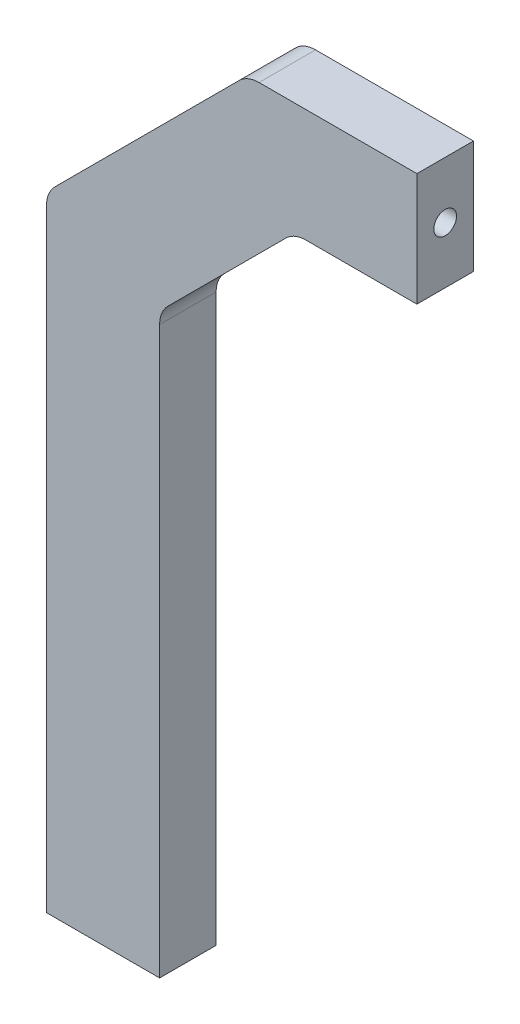
ISO-10303-21;
HEADER;
FILE_DESCRIPTION(('STEP AP214'),'2;1');
FILE_NAME('part.step','',(''),(''),'','','');
FILE_SCHEMA(('AUTOMOTIVE_DESIGN { 1 0 10303 214 1 1 1 1 }'));
ENDSEC;
DATA;
#1=APPLICATION_CONTEXT('core data for automotive mechanical design processes');
#2=APPLICATION_PROTOCOL_DEFINITION('international standard','automotive_design',2000,#1);
#3=PRODUCT_CONTEXT('',#1,'mechanical');
#4=PRODUCT('Part','Part','',(#3));
#5=PRODUCT_RELATED_PRODUCT_CATEGORY('part','',(#4));
#6=PRODUCT_DEFINITION_FORMATION('','',#4);
#7=PRODUCT_DEFINITION_CONTEXT('part definition',#1,'design');
#8=PRODUCT_DEFINITION('design','',#6,#7);
#9=PRODUCT_DEFINITION_SHAPE('','',#8);
#10=(LENGTH_UNIT() NAMED_UNIT(*) SI_UNIT(.MILLI.,.METRE.));
#11=(NAMED_UNIT(*) PLANE_ANGLE_UNIT() SI_UNIT($,.RADIAN.));
#12=(NAMED_UNIT(*) SI_UNIT($,.STERADIAN.) SOLID_ANGLE_UNIT());
#13=UNCERTAINTY_MEASURE_WITH_UNIT(LENGTH_MEASURE(1.E-05),#10,'distance_accuracy_value','');
#14=(GEOMETRIC_REPRESENTATION_CONTEXT(3) GLOBAL_UNCERTAINTY_ASSIGNED_CONTEXT((#13)) GLOBAL_UNIT_ASSIGNED_CONTEXT((#10,
#11,#12)) REPRESENTATION_CONTEXT('',''));
#15=CARTESIAN_POINT('',(0.,0.,0.));
#16=DIRECTION('',(0.,0.,1.));
#17=DIRECTION('',(1.,0.,0.));
#18=AXIS2_PLACEMENT_3D('',#15,#16,#17);
#19=CARTESIAN_POINT('',(0.,12.7,6.35));
#20=DIRECTION('',(0.,-1.,0.));
#21=DIRECTION('',(1.,0.,0.));
#22=AXIS2_PLACEMENT_3D('',#19,#20,#21);
#23=PLANE('',#22);
#24=DIRECTION('',(-1.,0.,0.));
#25=VECTOR('',#24,1.);
#26=CARTESIAN_POINT('',(0.,12.7,-6.35));
#27=LINE('',#26,#25);
#28=CARTESIAN_POINT('',(0.,12.7,-6.35));
#29=VERTEX_POINT('',#28);
#30=CARTESIAN_POINT('',(-35.4697438789308,12.7,-6.35));
#31=VERTEX_POINT('',#30);
#32=EDGE_CURVE('E157',#29,#31,#27,.T.);
#33=ORIENTED_EDGE('',*,*,#32,.T.);
#34=DIRECTION('',(0.,0.,-1.));
#35=VECTOR('',#34,1.);
#36=CARTESIAN_POINT('',(-35.4697438789308,12.7,6.35));
#37=LINE('',#36,#35);
#38=CARTESIAN_POINT('',(-35.4697438789308,12.7,6.35));
#39=VERTEX_POINT('',#38);
#40=EDGE_CURVE('E64',#31,#39,#37,.F.);
#41=ORIENTED_EDGE('',*,*,#40,.T.);
#42=DIRECTION('',(-1.,0.,0.));
#43=VECTOR('',#42,1.);
#44=CARTESIAN_POINT('',(0.,12.7,6.35));
#45=LINE('',#44,#43);
#46=CARTESIAN_POINT('',(0.,12.7,6.35));
#47=VERTEX_POINT('',#46);
#48=EDGE_CURVE('E158',#47,#39,#45,.T.);
#49=ORIENTED_EDGE('',*,*,#48,.F.);
#50=DIRECTION('',(0.,0.,-1.));
#51=VECTOR('',#50,1.);
#52=CARTESIAN_POINT('',(0.,12.7,6.35));
#53=LINE('',#52,#51);
#54=EDGE_CURVE('E177',#47,#29,#53,.T.);
#55=ORIENTED_EDGE('',*,*,#54,.T.);
#56=EDGE_LOOP('',(#33,#41,#49,#55));
#57=FACE_BOUND('',#56,.T.);
#58=ADVANCED_FACE('F41',(#57),#23,.F.);
#59=CARTESIAN_POINT('',(-38.1,12.7,6.35));
#60=DIRECTION('',(0.707106781186549,-0.707106781186546,0.));
#61=DIRECTION('',(0.707106781186546,0.707106781186549,0.));
#62=AXIS2_PLACEMENT_3D('',#59,#60,#61);
#63=PLANE('',#62);
#64=DIRECTION('',(-0.707106781186546,-0.707106781186549,0.));
#65=VECTOR('',#64,1.);
#66=CARTESIAN_POINT('',(-38.1,12.7,6.35));
#67=LINE('',#66,#65);
#68=CARTESIAN_POINT('',(-39.9598719394654,10.8401280605346,6.35));
#69=VERTEX_POINT('',#68);
#70=CARTESIAN_POINT('',(-81.3505280605346,-30.5505280605347,6.35));
#71=VERTEX_POINT('',#70);
#72=EDGE_CURVE('E160',#69,#71,#67,.T.);
#73=ORIENTED_EDGE('',*,*,#72,.F.);
#74=DIRECTION('',(0.,0.,-1.));
#75=VECTOR('',#74,1.);
#76=CARTESIAN_POINT('',(-39.9598719394654,10.8401280605346,6.35));
#77=LINE('',#76,#75);
#78=CARTESIAN_POINT('',(-39.9598719394654,10.8401280605346,-6.35));
#79=VERTEX_POINT('',#78);
#80=EDGE_CURVE('E218',#69,#79,#77,.T.);
#81=ORIENTED_EDGE('',*,*,#80,.T.);
#82=DIRECTION('',(-0.707106781186546,-0.707106781186549,0.));
#83=VECTOR('',#82,1.);
#84=CARTESIAN_POINT('',(-38.1,12.7,-6.35));
#85=LINE('',#84,#83);
#86=CARTESIAN_POINT('',(-81.3505280605346,-30.5505280605347,-6.35));
#87=VERTEX_POINT('',#86);
#88=EDGE_CURVE('E179',#79,#87,#85,.T.);
#89=ORIENTED_EDGE('',*,*,#88,.T.);
#90=DIRECTION('',(0.,0.,-1.));
#91=VECTOR('',#90,1.);
#92=CARTESIAN_POINT('',(-81.3505280605346,-30.5505280605347,6.35));
#93=LINE('',#92,#91);
#94=EDGE_CURVE('E216',#87,#71,#93,.F.);
#95=ORIENTED_EDGE('',*,*,#94,.T.);
#96=EDGE_LOOP('',(#73,#81,#89,#95));
#97=FACE_BOUND('',#96,.T.);
#98=ADVANCED_FACE('F275',(#97),#63,.F.);
#99=CARTESIAN_POINT('',(-83.2104,-32.4104000000002,6.35));
#100=DIRECTION('',(1.,0.,0.));
#101=DIRECTION('',(0.,0.,-1.));
#102=AXIS2_PLACEMENT_3D('',#99,#100,#101);
#103=PLANE('',#102);
#104=DIRECTION('',(0.,-1.,0.));
#105=VECTOR('',#104,1.);
#106=CARTESIAN_POINT('',(-83.2104,-32.4104000000002,6.35));
#107=LINE('',#106,#105);
#108=CARTESIAN_POINT('',(-83.2104,-35.0406561210693,6.35));
#109=VERTEX_POINT('',#108);
#110=CARTESIAN_POINT('',(-83.2104,-172.72,6.35));
#111=VERTEX_POINT('',#110);
#112=EDGE_CURVE('E163',#109,#111,#107,.T.);
#113=ORIENTED_EDGE('',*,*,#112,.F.);
#114=DIRECTION('',(0.,0.,-1.));
#115=VECTOR('',#114,1.);
#116=CARTESIAN_POINT('',(-83.2104,-35.0406561210693,6.35));
#117=LINE('',#116,#115);
#118=CARTESIAN_POINT('',(-83.2104,-35.0406561210693,-6.35));
#119=VERTEX_POINT('',#118);
#120=EDGE_CURVE('E229',#109,#119,#117,.T.);
#121=ORIENTED_EDGE('',*,*,#120,.T.);
#122=DIRECTION('',(0.,-1.,0.));
#123=VECTOR('',#122,1.);
#124=CARTESIAN_POINT('',(-83.2104,-32.4104000000002,-6.35));
#125=LINE('',#124,#123);
#126=CARTESIAN_POINT('',(-83.2104,-172.72,-6.35));
#127=VERTEX_POINT('',#126);
#128=EDGE_CURVE('E182',#119,#127,#125,.T.);
#129=ORIENTED_EDGE('',*,*,#128,.T.);
#130=DIRECTION('',(0.,0.,-1.));
#131=VECTOR('',#130,1.);
#132=CARTESIAN_POINT('',(-83.2104,-172.72,6.35));
#133=LINE('',#132,#131);
#134=EDGE_CURVE('E203',#111,#127,#133,.T.);
#135=ORIENTED_EDGE('',*,*,#134,.F.);
#136=EDGE_LOOP('',(#113,#121,#129,#135));
#137=FACE_BOUND('',#136,.T.);
#138=ADVANCED_FACE('F282',(#137),#103,.F.);
#139=CARTESIAN_POINT('',(-57.8104,-172.72,6.35));
#140=DIRECTION('',(0.,1.,0.));
#141=DIRECTION('',(0.,0.,1.));
#142=AXIS2_PLACEMENT_3D('',#139,#140,#141);
#143=PLANE('',#142);
#144=CARTESIAN_POINT('',(-70.5104,-172.72,0.));
#145=DIRECTION('',(0.,-1.,0.));
#146=DIRECTION('',(0.,0.,-1.));
#147=AXIS2_PLACEMENT_3D('',#144,#145,#146);
#148=CIRCLE('',#147,2.55269999999999);
#149=CARTESIAN_POINT('',(-70.5104,-172.72,-2.55269999999999));
#150=VERTEX_POINT('',#149);
#151=EDGE_CURVE('E147',#150,#150,#148,.T.);
#152=ORIENTED_EDGE('',*,*,#151,.F.);
#153=EDGE_LOOP('',(#152));
#154=FACE_BOUND('',#153,.T.);
#155=DIRECTION('',(1.,0.,0.));
#156=VECTOR('',#155,1.);
#157=CARTESIAN_POINT('',(-57.8104,-172.72,-6.35));
#158=LINE('',#157,#156);
#159=CARTESIAN_POINT('',(-57.8104,-172.72,-6.35));
#160=VERTEX_POINT('',#159);
#161=EDGE_CURVE('E184',#127,#160,#158,.T.);
#162=ORIENTED_EDGE('',*,*,#161,.T.);
#163=DIRECTION('',(0.,0.,-1.));
#164=VECTOR('',#163,1.);
#165=CARTESIAN_POINT('',(-57.8104,-172.72,6.35));
#166=LINE('',#165,#164);
#167=CARTESIAN_POINT('',(-57.8104,-172.72,6.35));
#168=VERTEX_POINT('',#167);
#169=EDGE_CURVE('E200',#168,#160,#166,.T.);
#170=ORIENTED_EDGE('',*,*,#169,.F.);
#171=DIRECTION('',(1.,0.,0.));
#172=VECTOR('',#171,1.);
#173=CARTESIAN_POINT('',(-57.8104,-172.72,6.35));
#174=LINE('',#173,#172);
#175=EDGE_CURVE('E165',#111,#168,#174,.T.);
#176=ORIENTED_EDGE('',*,*,#175,.F.);
#177=ORIENTED_EDGE('',*,*,#134,.T.);
#178=EDGE_LOOP('',(#162,#170,#176,#177));
#179=FACE_BOUND('',#178,.T.);
#180=ADVANCED_FACE('F286',(#154,#179),#143,.F.);
#181=CARTESIAN_POINT('',(-57.8104,-42.9314244842767,6.35));
#182=DIRECTION('',(-1.,0.,0.));
#183=DIRECTION('',(0.,0.,1.));
#184=AXIS2_PLACEMENT_3D('',#181,#182,#183);
#185=PLANE('',#184);
#186=DIRECTION('',(0.,1.,0.));
#187=VECTOR('',#186,1.);
#188=CARTESIAN_POINT('',(-57.8104,-42.9314244842767,-6.35));
#189=LINE('',#188,#187);
#190=CARTESIAN_POINT('',(-57.8104,-45.5616806053459,-6.35));
#191=VERTEX_POINT('',#190);
#192=EDGE_CURVE('E186',#160,#191,#189,.T.);
#193=ORIENTED_EDGE('',*,*,#192,.T.);
#194=DIRECTION('',(0.,0.,-1.));
#195=VECTOR('',#194,1.);
#196=CARTESIAN_POINT('',(-57.8104,-45.5616806053459,6.35));
#197=LINE('',#196,#195);
#198=CARTESIAN_POINT('',(-57.8104,-45.5616806053459,6.35));
#199=VERTEX_POINT('',#198);
#200=EDGE_CURVE('E214',#191,#199,#197,.F.);
#201=ORIENTED_EDGE('',*,*,#200,.T.);
#202=DIRECTION('',(0.,1.,0.));
#203=VECTOR('',#202,1.);
#204=CARTESIAN_POINT('',(-57.8104,-42.9314244842767,6.35));
#205=LINE('',#204,#203);
#206=EDGE_CURVE('E167',#168,#199,#205,.T.);
#207=ORIENTED_EDGE('',*,*,#206,.F.);
#208=ORIENTED_EDGE('',*,*,#169,.T.);
#209=EDGE_LOOP('',(#193,#201,#207,#208));
#210=FACE_BOUND('',#209,.T.);
#211=ADVANCED_FACE('F245',(#210),#185,.F.);
#212=CARTESIAN_POINT('',(-27.5789755157234,-12.7,6.35));
#213=DIRECTION('',(-0.707106781186549,0.707106781186546,0.));
#214=DIRECTION('',(-0.707106781186546,-0.707106781186549,0.));
#215=AXIS2_PLACEMENT_3D('',#212,#213,#214);
#216=PLANE('',#215);
#217=DIRECTION('',(0.707106781186546,0.707106781186549,0.));
#218=VECTOR('',#217,1.);
#219=CARTESIAN_POINT('',(-27.5789755157234,-12.7,-6.35));
#220=LINE('',#219,#218);
#221=CARTESIAN_POINT('',(-55.9505280605346,-41.0715525448113,-6.35));
#222=VERTEX_POINT('',#221);
#223=CARTESIAN_POINT('',(-29.4388474551888,-14.5598719394654,-6.35));
#224=VERTEX_POINT('',#223);
#225=EDGE_CURVE('E189',#222,#224,#220,.T.);
#226=ORIENTED_EDGE('',*,*,#225,.T.);
#227=DIRECTION('',(0.,0.,-1.));
#228=VECTOR('',#227,1.);
#229=CARTESIAN_POINT('',(-29.4388474551888,-14.5598719394654,6.35));
#230=LINE('',#229,#228);
#231=CARTESIAN_POINT('',(-29.4388474551888,-14.5598719394654,6.35));
#232=VERTEX_POINT('',#231);
#233=EDGE_CURVE('E212',#224,#232,#230,.F.);
#234=ORIENTED_EDGE('',*,*,#233,.T.);
#235=DIRECTION('',(0.707106781186546,0.707106781186549,0.));
#236=VECTOR('',#235,1.);
#237=CARTESIAN_POINT('',(-27.5789755157234,-12.7,6.35));
#238=LINE('',#237,#236);
#239=CARTESIAN_POINT('',(-55.9505280605346,-41.0715525448113,6.35));
#240=VERTEX_POINT('',#239);
#241=EDGE_CURVE('E170',#240,#232,#238,.T.);
#242=ORIENTED_EDGE('',*,*,#241,.F.);
#243=DIRECTION('',(0.,0.,-1.));
#244=VECTOR('',#243,1.);
#245=CARTESIAN_POINT('',(-55.9505280605346,-41.0715525448113,-6.35));
#246=LINE('',#245,#244);
#247=EDGE_CURVE('E209',#240,#222,#246,.T.);
#248=ORIENTED_EDGE('',*,*,#247,.T.);
#249=EDGE_LOOP('',(#226,#234,#242,#248));
#250=FACE_BOUND('',#249,.T.);
#251=ADVANCED_FACE('F254',(#250),#216,.F.);
#252=CARTESIAN_POINT('',(0.,-12.7,6.35));
#253=DIRECTION('',(0.,1.,0.));
#254=DIRECTION('',(0.,0.,1.));
#255=AXIS2_PLACEMENT_3D('',#252,#253,#254);
#256=PLANE('',#255);
#257=DIRECTION('',(1.,0.,0.));
#258=VECTOR('',#257,1.);
#259=CARTESIAN_POINT('',(0.,-12.7,6.35));
#260=LINE('',#259,#258);
#261=CARTESIAN_POINT('',(-24.9487193946542,-12.7,6.35));
#262=VERTEX_POINT('',#261);
#263=CARTESIAN_POINT('',(0.,-12.7,6.35));
#264=VERTEX_POINT('',#263);
#265=EDGE_CURVE('E173',#262,#264,#260,.T.);
#266=ORIENTED_EDGE('',*,*,#265,.F.);
#267=DIRECTION('',(0.,0.,-1.));
#268=VECTOR('',#267,1.);
#269=CARTESIAN_POINT('',(-24.9487193946542,-12.7,-6.35));
#270=LINE('',#269,#268);
#271=CARTESIAN_POINT('',(-24.9487193946542,-12.7,-6.35));
#272=VERTEX_POINT('',#271);
#273=EDGE_CURVE('E206',#262,#272,#270,.T.);
#274=ORIENTED_EDGE('',*,*,#273,.T.);
#275=DIRECTION('',(1.,0.,0.));
#276=VECTOR('',#275,1.);
#277=CARTESIAN_POINT('',(0.,-12.7,-6.35));
#278=LINE('',#277,#276);
#279=CARTESIAN_POINT('',(0.,-12.7,-6.35));
#280=VERTEX_POINT('',#279);
#281=EDGE_CURVE('E192',#272,#280,#278,.T.);
#282=ORIENTED_EDGE('',*,*,#281,.T.);
#283=DIRECTION('',(0.,0.,-1.));
#284=VECTOR('',#283,1.);
#285=CARTESIAN_POINT('',(0.,-12.7,6.35));
#286=LINE('',#285,#284);
#287=EDGE_CURVE('E197',#264,#280,#286,.T.);
#288=ORIENTED_EDGE('',*,*,#287,.F.);
#289=EDGE_LOOP('',(#266,#274,#282,#288));
#290=FACE_BOUND('',#289,.T.);
#291=ADVANCED_FACE('F262',(#290),#256,.F.);
#292=CARTESIAN_POINT('',(0.,12.7,6.35));
#293=DIRECTION('',(-1.,0.,0.));
#294=DIRECTION('',(0.,-1.,0.));
#295=AXIS2_PLACEMENT_3D('',#292,#293,#294);
#296=PLANE('',#295);
#297=CARTESIAN_POINT('',(0.,0.,0.));
#298=DIRECTION('',(1.,0.,0.));
#299=DIRECTION('',(0.,0.,-1.));
#300=AXIS2_PLACEMENT_3D('',#297,#298,#299);
#301=CIRCLE('',#300,2.55269999999999);
#302=CARTESIAN_POINT('',(0.,0.,-2.55269999999999));
#303=VERTEX_POINT('',#302);
#304=EDGE_CURVE('E146',#303,#303,#301,.T.);
#305=ORIENTED_EDGE('',*,*,#304,.F.);
#306=EDGE_LOOP('',(#305));
#307=FACE_BOUND('',#306,.T.);
#308=DIRECTION('',(0.,1.,0.));
#309=VECTOR('',#308,1.);
#310=CARTESIAN_POINT('',(0.,12.7,-6.35));
#311=LINE('',#310,#309);
#312=EDGE_CURVE('E161',#280,#29,#311,.T.);
#313=ORIENTED_EDGE('',*,*,#312,.T.);
#314=ORIENTED_EDGE('',*,*,#54,.F.);
#315=DIRECTION('',(0.,1.,0.));
#316=VECTOR('',#315,1.);
#317=CARTESIAN_POINT('',(0.,12.7,6.35));
#318=LINE('',#317,#316);
#319=EDGE_CURVE('E175',#264,#47,#318,.T.);
#320=ORIENTED_EDGE('',*,*,#319,.F.);
#321=ORIENTED_EDGE('',*,*,#287,.T.);
#322=EDGE_LOOP('',(#313,#314,#320,#321));
#323=FACE_BOUND('',#322,.T.);
#324=ADVANCED_FACE('F268',(#307,#323),#296,.F.);
#325=CARTESIAN_POINT('',(0.,0.,6.35));
#326=DIRECTION('',(0.,0.,1.));
#327=DIRECTION('',(1.,0.,0.));
#328=AXIS2_PLACEMENT_3D('',#325,#326,#327);
#329=PLANE('',#328);
#330=ORIENTED_EDGE('',*,*,#48,.T.);
#331=CARTESIAN_POINT('',(-35.4697438789308,6.34999999999999,6.35));
#332=DIRECTION('',(0.,0.,1.));
#333=DIRECTION('',(1.,0.,0.));
#334=AXIS2_PLACEMENT_3D('',#331,#332,#333);
#335=CIRCLE('',#334,6.35);
#336=EDGE_CURVE('E227',#39,#69,#335,.T.);
#337=ORIENTED_EDGE('',*,*,#336,.T.);
#338=ORIENTED_EDGE('',*,*,#72,.T.);
#339=CARTESIAN_POINT('',(-76.8604,-35.0406561210693,6.35));
#340=DIRECTION('',(0.,0.,1.));
#341=DIRECTION('',(1.,0.,0.));
#342=AXIS2_PLACEMENT_3D('',#339,#340,#341);
#343=CIRCLE('',#342,6.35);
#344=EDGE_CURVE('E56',#71,#109,#343,.T.);
#345=ORIENTED_EDGE('',*,*,#344,.T.);
#346=ORIENTED_EDGE('',*,*,#112,.T.);
#347=ORIENTED_EDGE('',*,*,#175,.T.);
#348=ORIENTED_EDGE('',*,*,#206,.T.);
#349=CARTESIAN_POINT('',(-51.4604,-45.5616806053459,6.35));
#350=DIRECTION('',(0.,0.,1.));
#351=DIRECTION('',(1.,0.,0.));
#352=AXIS2_PLACEMENT_3D('',#349,#350,#351);
#353=CIRCLE('',#352,6.35);
#354=EDGE_CURVE('E11',#199,#240,#353,.F.);
#355=ORIENTED_EDGE('',*,*,#354,.T.);
#356=ORIENTED_EDGE('',*,*,#241,.T.);
#357=CARTESIAN_POINT('',(-24.9487193946542,-19.05,6.35));
#358=DIRECTION('',(0.,0.,1.));
#359=DIRECTION('',(1.,0.,0.));
#360=AXIS2_PLACEMENT_3D('',#357,#358,#359);
#361=CIRCLE('',#360,6.35);
#362=EDGE_CURVE('E234',#232,#262,#361,.F.);
#363=ORIENTED_EDGE('',*,*,#362,.T.);
#364=ORIENTED_EDGE('',*,*,#265,.T.);
#365=ORIENTED_EDGE('',*,*,#319,.T.);
#366=EDGE_LOOP('',(#330,#337,#338,#345,#346,#347,#348,#355,#356,#363,#364,#365));
#367=FACE_BOUND('',#366,.T.);
#368=ADVANCED_FACE('F251',(#367),#329,.T.);
#369=CARTESIAN_POINT('',(0.,0.,-6.35));
#370=DIRECTION('',(0.,0.,1.));
#371=DIRECTION('',(1.,0.,0.));
#372=AXIS2_PLACEMENT_3D('',#369,#370,#371);
#373=PLANE('',#372);
#374=ORIENTED_EDGE('',*,*,#88,.F.);
#375=CARTESIAN_POINT('',(-35.4697438789308,6.34999999999999,-6.35));
#376=DIRECTION('',(0.,0.,1.));
#377=DIRECTION('',(1.,0.,0.));
#378=AXIS2_PLACEMENT_3D('',#375,#376,#377);
#379=CIRCLE('',#378,6.35);
#380=EDGE_CURVE('E223',#79,#31,#379,.F.);
#381=ORIENTED_EDGE('',*,*,#380,.T.);
#382=ORIENTED_EDGE('',*,*,#32,.F.);
#383=ORIENTED_EDGE('',*,*,#312,.F.);
#384=ORIENTED_EDGE('',*,*,#281,.F.);
#385=CARTESIAN_POINT('',(-24.9487193946542,-19.05,-6.35));
#386=DIRECTION('',(0.,0.,1.));
#387=DIRECTION('',(1.,0.,0.));
#388=AXIS2_PLACEMENT_3D('',#385,#386,#387);
#389=CIRCLE('',#388,6.35);
#390=EDGE_CURVE('E232',#272,#224,#389,.T.);
#391=ORIENTED_EDGE('',*,*,#390,.T.);
#392=ORIENTED_EDGE('',*,*,#225,.F.);
#393=CARTESIAN_POINT('',(-51.4604,-45.5616806053459,-6.35));
#394=DIRECTION('',(0.,0.,1.));
#395=DIRECTION('',(1.,0.,0.));
#396=AXIS2_PLACEMENT_3D('',#393,#394,#395);
#397=CIRCLE('',#396,6.35);
#398=EDGE_CURVE('E49',#222,#191,#397,.T.);
#399=ORIENTED_EDGE('',*,*,#398,.T.);
#400=ORIENTED_EDGE('',*,*,#192,.F.);
#401=ORIENTED_EDGE('',*,*,#161,.F.);
#402=ORIENTED_EDGE('',*,*,#128,.F.);
#403=CARTESIAN_POINT('',(-76.8604,-35.0406561210693,-6.35));
#404=DIRECTION('',(0.,0.,1.));
#405=DIRECTION('',(1.,0.,0.));
#406=AXIS2_PLACEMENT_3D('',#403,#404,#405);
#407=CIRCLE('',#406,6.35);
#408=EDGE_CURVE('E221',#119,#87,#407,.F.);
#409=ORIENTED_EDGE('',*,*,#408,.T.);
#410=EDGE_LOOP('',(#374,#381,#382,#383,#384,#391,#392,#399,#400,#401,#402,#409));
#411=FACE_BOUND('',#410,.T.);
#412=ADVANCED_FACE('F239',(#411),#373,.F.);
#413=CARTESIAN_POINT('',(-24.9487193946542,-19.05,6.35));
#414=DIRECTION('',(0.,0.,1.));
#415=DIRECTION('',(1.,0.,0.));
#416=AXIS2_PLACEMENT_3D('',#413,#414,#415);
#417=CYLINDRICAL_SURFACE('',#416,6.35);
#418=ORIENTED_EDGE('',*,*,#362,.F.);
#419=ORIENTED_EDGE('',*,*,#233,.F.);
#420=ORIENTED_EDGE('',*,*,#390,.F.);
#421=ORIENTED_EDGE('',*,*,#273,.F.);
#422=EDGE_LOOP('',(#418,#419,#420,#421));
#423=FACE_BOUND('',#422,.T.);
#424=ADVANCED_FACE('F257',(#423),#417,.F.);
#425=CARTESIAN_POINT('',(-51.4604,-45.5616806053459,6.35));
#426=DIRECTION('',(0.,0.,1.));
#427=DIRECTION('',(1.,0.,0.));
#428=AXIS2_PLACEMENT_3D('',#425,#426,#427);
#429=CYLINDRICAL_SURFACE('',#428,6.35);
#430=ORIENTED_EDGE('',*,*,#354,.F.);
#431=ORIENTED_EDGE('',*,*,#200,.F.);
#432=ORIENTED_EDGE('',*,*,#398,.F.);
#433=ORIENTED_EDGE('',*,*,#247,.F.);
#434=EDGE_LOOP('',(#430,#431,#432,#433));
#435=FACE_BOUND('',#434,.T.);
#436=ADVANCED_FACE('F249',(#435),#429,.F.);
#437=CARTESIAN_POINT('',(-35.4697438789308,6.34999999999999,6.35));
#438=DIRECTION('',(0.,0.,-1.));
#439=DIRECTION('',(-1.,0.,0.));
#440=AXIS2_PLACEMENT_3D('',#437,#438,#439);
#441=CYLINDRICAL_SURFACE('',#440,6.35);
#442=ORIENTED_EDGE('',*,*,#336,.F.);
#443=ORIENTED_EDGE('',*,*,#40,.F.);
#444=ORIENTED_EDGE('',*,*,#380,.F.);
#445=ORIENTED_EDGE('',*,*,#80,.F.);
#446=EDGE_LOOP('',(#442,#443,#444,#445));
#447=FACE_BOUND('',#446,.T.);
#448=ADVANCED_FACE('F273',(#447),#441,.T.);
#449=CARTESIAN_POINT('',(-76.8604,-35.0406561210693,6.35));
#450=DIRECTION('',(0.,0.,-1.));
#451=DIRECTION('',(-1.,0.,0.));
#452=AXIS2_PLACEMENT_3D('',#449,#450,#451);
#453=CYLINDRICAL_SURFACE('',#452,6.35);
#454=ORIENTED_EDGE('',*,*,#344,.F.);
#455=ORIENTED_EDGE('',*,*,#94,.F.);
#456=ORIENTED_EDGE('',*,*,#408,.F.);
#457=ORIENTED_EDGE('',*,*,#120,.F.);
#458=EDGE_LOOP('',(#454,#455,#456,#457));
#459=FACE_BOUND('',#458,.T.);
#460=ADVANCED_FACE('F43',(#459),#453,.T.);
#461=CARTESIAN_POINT('',(-12.7,0.,0.));
#462=DIRECTION('',(1.,0.,0.));
#463=DIRECTION('',(0.,0.,-1.));
#464=AXIS2_PLACEMENT_3D('',#461,#462,#463);
#465=CONICAL_SURFACE('',#464,2.5527,1.02974425867665);
#466=CARTESIAN_POINT('',(-14.2338169021917,0.,0.));
#467=VERTEX_POINT('',#466);
#468=VERTEX_LOOP('',#467);
#469=FACE_BOUND('',#468,.T.);
#470=CARTESIAN_POINT('',(-12.7,0.,0.));
#471=DIRECTION('',(1.,0.,0.));
#472=DIRECTION('',(0.,0.,-1.));
#473=AXIS2_PLACEMENT_3D('',#470,#471,#472);
#474=CIRCLE('',#473,2.5527);
#475=CARTESIAN_POINT('',(-12.7,0.,-2.5527));
#476=VERTEX_POINT('',#475);
#477=EDGE_CURVE('E150',#476,#476,#474,.T.);
#478=ORIENTED_EDGE('',*,*,#477,.T.);
#479=EDGE_LOOP('',(#478));
#480=FACE_BOUND('',#479,.T.);
#481=ADVANCED_FACE('F312',(#469,#480),#465,.F.);
#482=CARTESIAN_POINT('',(0.,0.,0.));
#483=DIRECTION('',(1.,0.,0.));
#484=DIRECTION('',(0.,0.,-1.));
#485=AXIS2_PLACEMENT_3D('',#482,#483,#484);
#486=CYLINDRICAL_SURFACE('',#485,2.55269999999999);
#487=ORIENTED_EDGE('',*,*,#477,.F.);
#488=EDGE_LOOP('',(#487));
#489=FACE_BOUND('',#488,.T.);
#490=ORIENTED_EDGE('',*,*,#304,.T.);
#491=EDGE_LOOP('',(#490));
#492=FACE_BOUND('',#491,.T.);
#493=ADVANCED_FACE('F140',(#489,#492),#486,.F.);
#494=CARTESIAN_POINT('',(-70.5104,-160.02,0.));
#495=DIRECTION('',(0.,-1.,0.));
#496=DIRECTION('',(0.,0.,-1.));
#497=AXIS2_PLACEMENT_3D('',#494,#495,#496);
#498=CONICAL_SURFACE('',#497,2.55269999999999,1.02974425867665);
#499=CARTESIAN_POINT('',(-70.5104,-158.486183097808,0.));
#500=VERTEX_POINT('',#499);
#501=VERTEX_LOOP('',#500);
#502=FACE_BOUND('',#501,.T.);
#503=CARTESIAN_POINT('',(-70.5104,-160.02,0.));
#504=DIRECTION('',(0.,-1.,0.));
#505=DIRECTION('',(0.,0.,-1.));
#506=AXIS2_PLACEMENT_3D('',#503,#504,#505);
#507=CIRCLE('',#506,2.55269999999999);
#508=CARTESIAN_POINT('',(-70.5104,-160.02,-2.55269999999999));
#509=VERTEX_POINT('',#508);
#510=EDGE_CURVE('E144',#509,#509,#507,.T.);
#511=ORIENTED_EDGE('',*,*,#510,.T.);
#512=EDGE_LOOP('',(#511));
#513=FACE_BOUND('',#512,.T.);
#514=ADVANCED_FACE('F136',(#502,#513),#498,.F.);
#515=CARTESIAN_POINT('',(-70.5104,-172.72,0.));
#516=DIRECTION('',(0.,-1.,0.));
#517=DIRECTION('',(0.,0.,-1.));
#518=AXIS2_PLACEMENT_3D('',#515,#516,#517);
#519=CYLINDRICAL_SURFACE('',#518,2.55269999999999);
#520=ORIENTED_EDGE('',*,*,#510,.F.);
#521=EDGE_LOOP('',(#520));
#522=FACE_BOUND('',#521,.T.);
#523=ORIENTED_EDGE('',*,*,#151,.T.);
#524=EDGE_LOOP('',(#523));
#525=FACE_BOUND('',#524,.T.);
#526=ADVANCED_FACE('F139',(#522,#525),#519,.F.);
#527=CLOSED_SHELL('',(#58,#98,#138,#180,#211,#251,#291,#324,#368,#412,#424,#436,#448,#460,#481,
#493,#514,#526));
#528=MANIFOLD_SOLID_BREP('B2',#527);
#529=ADVANCED_BREP_SHAPE_REPRESENTATION('',(#18,#528),#14);
#530=SHAPE_DEFINITION_REPRESENTATION(#9,#529);
ENDSEC;
END-ISO-10303-21;
